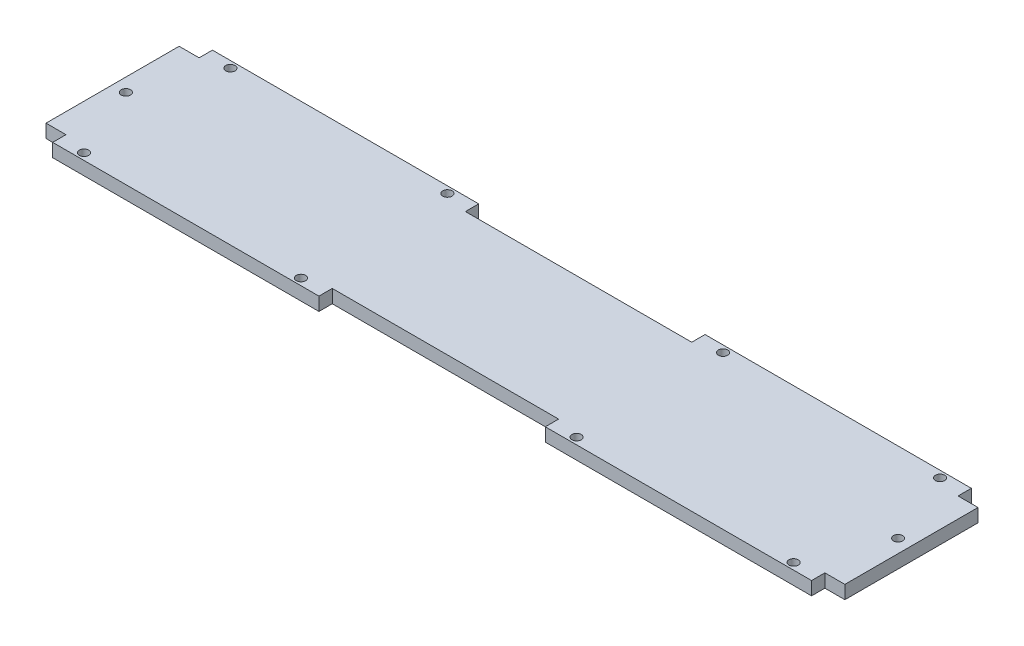
ISO-10303-21;
HEADER;
FILE_DESCRIPTION(('STEP AP214'),'2;1');
FILE_NAME('part.step','',(''),(''),'','','');
FILE_SCHEMA(('AUTOMOTIVE_DESIGN { 1 0 10303 214 1 1 1 1 }'));
ENDSEC;
DATA;
#1=APPLICATION_CONTEXT('core data for automotive mechanical design processes');
#2=APPLICATION_PROTOCOL_DEFINITION('international standard','automotive_design',2000,#1);
#3=PRODUCT_CONTEXT('',#1,'mechanical');
#4=PRODUCT('Part','Part','',(#3));
#5=PRODUCT_RELATED_PRODUCT_CATEGORY('part','',(#4));
#6=PRODUCT_DEFINITION_FORMATION('','',#4);
#7=PRODUCT_DEFINITION_CONTEXT('part definition',#1,'design');
#8=PRODUCT_DEFINITION('design','',#6,#7);
#9=PRODUCT_DEFINITION_SHAPE('','',#8);
#10=(LENGTH_UNIT() NAMED_UNIT(*) SI_UNIT(.MILLI.,.METRE.));
#11=(NAMED_UNIT(*) PLANE_ANGLE_UNIT() SI_UNIT($,.RADIAN.));
#12=(NAMED_UNIT(*) SI_UNIT($,.STERADIAN.) SOLID_ANGLE_UNIT());
#13=UNCERTAINTY_MEASURE_WITH_UNIT(LENGTH_MEASURE(1.E-05),#10,'distance_accuracy_value','');
#14=(GEOMETRIC_REPRESENTATION_CONTEXT(3) GLOBAL_UNCERTAINTY_ASSIGNED_CONTEXT((#13)) GLOBAL_UNIT_ASSIGNED_CONTEXT((#10,
#11,#12)) REPRESENTATION_CONTEXT('',''));
#15=CARTESIAN_POINT('',(0.,0.,0.));
#16=DIRECTION('',(0.,0.,1.));
#17=DIRECTION('',(1.,0.,0.));
#18=AXIS2_PLACEMENT_3D('',#15,#16,#17);
#19=CARTESIAN_POINT('',(-133.25,5.,2.50000000000001));
#20=DIRECTION('',(0.,-1.,0.));
#21=DIRECTION('',(0.,0.,-1.));
#22=AXIS2_PLACEMENT_3D('',#19,#20,#21);
#23=CYLINDRICAL_SURFACE('',#22,1.75000000000001);
#24=CARTESIAN_POINT('',(-133.25,5.,2.50000000000001));
#25=DIRECTION('',(0.,1.,0.));
#26=DIRECTION('',(0.,0.,1.));
#27=AXIS2_PLACEMENT_3D('',#24,#25,#26);
#28=CIRCLE('',#27,1.75000000000001);
#29=CARTESIAN_POINT('',(-133.25,5.,4.25000000000002));
#30=VERTEX_POINT('',#29);
#31=EDGE_CURVE('E449',#30,#30,#28,.F.);
#32=ORIENTED_EDGE('',*,*,#31,.F.);
#33=EDGE_LOOP('',(#32));
#34=FACE_BOUND('',#33,.T.);
#35=CARTESIAN_POINT('',(-133.25,0.,2.50000000000001));
#36=DIRECTION('',(0.,1.,0.));
#37=DIRECTION('',(0.,0.,1.));
#38=AXIS2_PLACEMENT_3D('',#35,#36,#37);
#39=CIRCLE('',#38,1.75000000000001);
#40=CARTESIAN_POINT('',(-133.25,0.,4.25000000000002));
#41=VERTEX_POINT('',#40);
#42=EDGE_CURVE('E391',#41,#41,#39,.F.);
#43=ORIENTED_EDGE('',*,*,#42,.T.);
#44=EDGE_LOOP('',(#43));
#45=FACE_BOUND('',#44,.T.);
#46=ADVANCED_FACE('F197',(#34,#45),#23,.F.);
#47=CARTESIAN_POINT('',(-51.75,5.,2.5));
#48=DIRECTION('',(0.,-1.,0.));
#49=DIRECTION('',(0.,0.,-1.));
#50=AXIS2_PLACEMENT_3D('',#47,#48,#49);
#51=CYLINDRICAL_SURFACE('',#50,1.75);
#52=CARTESIAN_POINT('',(-51.75,5.,2.5));
#53=DIRECTION('',(0.,1.,0.));
#54=DIRECTION('',(0.,0.,1.));
#55=AXIS2_PLACEMENT_3D('',#52,#53,#54);
#56=CIRCLE('',#55,1.75);
#57=CARTESIAN_POINT('',(-51.75,5.,4.25));
#58=VERTEX_POINT('',#57);
#59=EDGE_CURVE('E445',#58,#58,#56,.T.);
#60=ORIENTED_EDGE('',*,*,#59,.T.);
#61=EDGE_LOOP('',(#60));
#62=FACE_BOUND('',#61,.T.);
#63=CARTESIAN_POINT('',(-51.75,0.,2.5));
#64=DIRECTION('',(0.,1.,0.));
#65=DIRECTION('',(0.,0.,1.));
#66=AXIS2_PLACEMENT_3D('',#63,#64,#65);
#67=CIRCLE('',#66,1.75);
#68=CARTESIAN_POINT('',(-51.75,0.,4.25));
#69=VERTEX_POINT('',#68);
#70=EDGE_CURVE('E504',#69,#69,#67,.T.);
#71=ORIENTED_EDGE('',*,*,#70,.F.);
#72=EDGE_LOOP('',(#71));
#73=FACE_BOUND('',#72,.T.);
#74=ADVANCED_FACE('F620',(#62,#73),#51,.F.);
#75=CARTESIAN_POINT('',(51.75,5.,2.49999999999955));
#76=DIRECTION('',(0.,-1.,0.));
#77=DIRECTION('',(0.,0.,-1.));
#78=AXIS2_PLACEMENT_3D('',#75,#76,#77);
#79=CYLINDRICAL_SURFACE('',#78,1.75);
#80=CARTESIAN_POINT('',(51.75,5.,2.49999999999955));
#81=DIRECTION('',(0.,1.,0.));
#82=DIRECTION('',(0.,0.,1.));
#83=AXIS2_PLACEMENT_3D('',#80,#81,#82);
#84=CIRCLE('',#83,1.75);
#85=CARTESIAN_POINT('',(51.75,5.,4.24999999999956));
#86=VERTEX_POINT('',#85);
#87=EDGE_CURVE('E441',#86,#86,#84,.F.);
#88=ORIENTED_EDGE('',*,*,#87,.F.);
#89=EDGE_LOOP('',(#88));
#90=FACE_BOUND('',#89,.T.);
#91=CARTESIAN_POINT('',(51.75,0.,2.49999999999955));
#92=DIRECTION('',(0.,1.,0.));
#93=DIRECTION('',(0.,0.,1.));
#94=AXIS2_PLACEMENT_3D('',#91,#92,#93);
#95=CIRCLE('',#94,1.75);
#96=CARTESIAN_POINT('',(51.75,0.,4.24999999999956));
#97=VERTEX_POINT('',#96);
#98=EDGE_CURVE('E500',#97,#97,#95,.F.);
#99=ORIENTED_EDGE('',*,*,#98,.T.);
#100=EDGE_LOOP('',(#99));
#101=FACE_BOUND('',#100,.T.);
#102=ADVANCED_FACE('F626',(#90,#101),#79,.F.);
#103=CARTESIAN_POINT('',(133.25,5.,2.50000000000001));
#104=DIRECTION('',(0.,-1.,0.));
#105=DIRECTION('',(0.,0.,-1.));
#106=AXIS2_PLACEMENT_3D('',#103,#104,#105);
#107=CYLINDRICAL_SURFACE('',#106,1.75000000000001);
#108=CARTESIAN_POINT('',(133.25,5.,2.50000000000001));
#109=DIRECTION('',(0.,1.,0.));
#110=DIRECTION('',(0.,0.,1.));
#111=AXIS2_PLACEMENT_3D('',#108,#109,#110);
#112=CIRCLE('',#111,1.75000000000001);
#113=CARTESIAN_POINT('',(133.25,5.,4.25000000000002));
#114=VERTEX_POINT('',#113);
#115=EDGE_CURVE('E437',#114,#114,#112,.T.);
#116=ORIENTED_EDGE('',*,*,#115,.T.);
#117=EDGE_LOOP('',(#116));
#118=FACE_BOUND('',#117,.T.);
#119=CARTESIAN_POINT('',(133.25,0.,2.50000000000001));
#120=DIRECTION('',(0.,1.,0.));
#121=DIRECTION('',(0.,0.,1.));
#122=AXIS2_PLACEMENT_3D('',#119,#120,#121);
#123=CIRCLE('',#122,1.75000000000001);
#124=CARTESIAN_POINT('',(133.25,0.,4.25000000000002));
#125=VERTEX_POINT('',#124);
#126=EDGE_CURVE('E496',#125,#125,#123,.T.);
#127=ORIENTED_EDGE('',*,*,#126,.F.);
#128=EDGE_LOOP('',(#127));
#129=FACE_BOUND('',#128,.T.);
#130=ADVANCED_FACE('F636',(#118,#129),#107,.F.);
#131=CARTESIAN_POINT('',(0.,5.,0.));
#132=DIRECTION('',(0.,0.,-1.));
#133=DIRECTION('',(-1.,0.,0.));
#134=AXIS2_PLACEMENT_3D('',#131,#132,#133);
#135=PLANE('',#134);
#136=DIRECTION('',(1.,0.,0.));
#137=VECTOR('',#136,1.);
#138=CARTESIAN_POINT('',(0.,0.,0.));
#139=LINE('',#138,#137);
#140=CARTESIAN_POINT('',(142.5,0.,0.));
#141=VERTEX_POINT('',#140);
#142=CARTESIAN_POINT('',(150.,0.,0.));
#143=VERTEX_POINT('',#142);
#144=EDGE_CURVE('E471',#141,#143,#139,.T.);
#145=ORIENTED_EDGE('',*,*,#144,.T.);
#146=DIRECTION('',(0.,-1.,0.));
#147=VECTOR('',#146,1.);
#148=CARTESIAN_POINT('',(150.,5.,0.));
#149=LINE('',#148,#147);
#150=CARTESIAN_POINT('',(150.,5.,0.));
#151=VERTEX_POINT('',#150);
#152=EDGE_CURVE('E453',#151,#143,#149,.T.);
#153=ORIENTED_EDGE('',*,*,#152,.F.);
#154=DIRECTION('',(1.,0.,0.));
#155=VECTOR('',#154,1.);
#156=CARTESIAN_POINT('',(0.,5.,0.));
#157=LINE('',#156,#155);
#158=CARTESIAN_POINT('',(142.5,5.,0.));
#159=VERTEX_POINT('',#158);
#160=EDGE_CURVE('E411',#159,#151,#157,.T.);
#161=ORIENTED_EDGE('',*,*,#160,.F.);
#162=DIRECTION('',(0.,-1.,0.));
#163=VECTOR('',#162,1.);
#164=CARTESIAN_POINT('',(142.5,5.,0.));
#165=LINE('',#164,#163);
#166=EDGE_CURVE('E514',#159,#141,#165,.T.);
#167=ORIENTED_EDGE('',*,*,#166,.T.);
#168=EDGE_LOOP('',(#145,#153,#161,#167));
#169=FACE_BOUND('',#168,.T.);
#170=ADVANCED_FACE('F640',(#169),#135,.F.);
#171=CARTESIAN_POINT('',(142.5,5.,0.));
#172=DIRECTION('',(-1.,0.,0.));
#173=DIRECTION('',(0.,0.,1.));
#174=AXIS2_PLACEMENT_3D('',#171,#172,#173);
#175=PLANE('',#174);
#176=DIRECTION('',(0.,0.,-1.));
#177=VECTOR('',#176,1.);
#178=CARTESIAN_POINT('',(142.5,0.,0.));
#179=LINE('',#178,#177);
#180=CARTESIAN_POINT('',(142.5,0.,5.));
#181=VERTEX_POINT('',#180);
#182=EDGE_CURVE('E492',#181,#141,#179,.T.);
#183=ORIENTED_EDGE('',*,*,#182,.T.);
#184=ORIENTED_EDGE('',*,*,#166,.F.);
#185=DIRECTION('',(0.,0.,-1.));
#186=VECTOR('',#185,1.);
#187=CARTESIAN_POINT('',(142.5,5.,0.));
#188=LINE('',#187,#186);
#189=CARTESIAN_POINT('',(142.5,5.,5.));
#190=VERTEX_POINT('',#189);
#191=EDGE_CURVE('E433',#190,#159,#188,.T.);
#192=ORIENTED_EDGE('',*,*,#191,.F.);
#193=DIRECTION('',(0.,-1.,0.));
#194=VECTOR('',#193,1.);
#195=CARTESIAN_POINT('',(142.5,5.,5.));
#196=LINE('',#195,#194);
#197=EDGE_CURVE('E518',#190,#181,#196,.T.);
#198=ORIENTED_EDGE('',*,*,#197,.T.);
#199=EDGE_LOOP('',(#183,#184,#192,#198));
#200=FACE_BOUND('',#199,.T.);
#201=ADVANCED_FACE('F644',(#200),#175,.F.);
#202=CARTESIAN_POINT('',(0.,5.,5.00000000000001));
#203=DIRECTION('',(0.,0.,1.));
#204=DIRECTION('',(1.,0.,0.));
#205=AXIS2_PLACEMENT_3D('',#202,#203,#204);
#206=PLANE('',#205);
#207=DIRECTION('',(-1.,0.,0.));
#208=VECTOR('',#207,1.);
#209=CARTESIAN_POINT('',(0.,0.,5.00000000000001));
#210=LINE('',#209,#208);
#211=CARTESIAN_POINT('',(42.5,0.,5.00000000000001));
#212=VERTEX_POINT('',#211);
#213=EDGE_CURVE('E488',#181,#212,#210,.T.);
#214=ORIENTED_EDGE('',*,*,#213,.F.);
#215=ORIENTED_EDGE('',*,*,#197,.F.);
#216=DIRECTION('',(-1.,0.,0.));
#217=VECTOR('',#216,1.);
#218=CARTESIAN_POINT('',(0.,5.,5.00000000000001));
#219=LINE('',#218,#217);
#220=CARTESIAN_POINT('',(42.5,5.,5.00000000000001));
#221=VERTEX_POINT('',#220);
#222=EDGE_CURVE('E429',#190,#221,#219,.T.);
#223=ORIENTED_EDGE('',*,*,#222,.T.);
#224=DIRECTION('',(0.,-1.,0.));
#225=VECTOR('',#224,1.);
#226=CARTESIAN_POINT('',(42.5,5.,5.00000000000001));
#227=LINE('',#226,#225);
#228=EDGE_CURVE('E522',#221,#212,#227,.T.);
#229=ORIENTED_EDGE('',*,*,#228,.T.);
#230=EDGE_LOOP('',(#214,#215,#223,#229));
#231=FACE_BOUND('',#230,.T.);
#232=ADVANCED_FACE('F649',(#231),#206,.T.);
#233=CARTESIAN_POINT('',(42.5,5.,0.));
#234=DIRECTION('',(-1.,0.,0.));
#235=DIRECTION('',(0.,0.,1.));
#236=AXIS2_PLACEMENT_3D('',#233,#234,#235);
#237=PLANE('',#236);
#238=DIRECTION('',(0.,0.,-1.));
#239=VECTOR('',#238,1.);
#240=CARTESIAN_POINT('',(42.5,0.,0.));
#241=LINE('',#240,#239);
#242=CARTESIAN_POINT('',(42.5,0.,0.));
#243=VERTEX_POINT('',#242);
#244=EDGE_CURVE('E484',#212,#243,#241,.T.);
#245=ORIENTED_EDGE('',*,*,#244,.F.);
#246=ORIENTED_EDGE('',*,*,#228,.F.);
#247=DIRECTION('',(0.,0.,-1.));
#248=VECTOR('',#247,1.);
#249=CARTESIAN_POINT('',(42.5,5.,0.));
#250=LINE('',#249,#248);
#251=CARTESIAN_POINT('',(42.5,5.,0.));
#252=VERTEX_POINT('',#251);
#253=EDGE_CURVE('E425',#221,#252,#250,.T.);
#254=ORIENTED_EDGE('',*,*,#253,.T.);
#255=DIRECTION('',(0.,-1.,0.));
#256=VECTOR('',#255,1.);
#257=CARTESIAN_POINT('',(42.5,5.,0.));
#258=LINE('',#257,#256);
#259=EDGE_CURVE('E526',#252,#243,#258,.T.);
#260=ORIENTED_EDGE('',*,*,#259,.T.);
#261=EDGE_LOOP('',(#245,#246,#254,#260));
#262=FACE_BOUND('',#261,.T.);
#263=ADVANCED_FACE('F653',(#262),#237,.T.);
#264=CARTESIAN_POINT('',(-42.5,0.,0.));
#265=VERTEX_POINT('',#264);
#266=EDGE_CURVE('E472',#265,#243,#139,.T.);
#267=ORIENTED_EDGE('',*,*,#266,.T.);
#268=ORIENTED_EDGE('',*,*,#259,.F.);
#269=CARTESIAN_POINT('',(-42.5,5.,0.));
#270=VERTEX_POINT('',#269);
#271=EDGE_CURVE('E412',#270,#252,#157,.T.);
#272=ORIENTED_EDGE('',*,*,#271,.F.);
#273=DIRECTION('',(0.,-1.,0.));
#274=VECTOR('',#273,1.);
#275=CARTESIAN_POINT('',(-42.5,5.,0.));
#276=LINE('',#275,#274);
#277=EDGE_CURVE('E530',#270,#265,#276,.T.);
#278=ORIENTED_EDGE('',*,*,#277,.T.);
#279=EDGE_LOOP('',(#267,#268,#272,#278));
#280=FACE_BOUND('',#279,.T.);
#281=ADVANCED_FACE('F646',(#280),#135,.F.);
#282=CARTESIAN_POINT('',(-42.5,5.,0.));
#283=DIRECTION('',(-1.,0.,0.));
#284=DIRECTION('',(0.,0.,1.));
#285=AXIS2_PLACEMENT_3D('',#282,#283,#284);
#286=PLANE('',#285);
#287=DIRECTION('',(0.,0.,-1.));
#288=VECTOR('',#287,1.);
#289=CARTESIAN_POINT('',(-42.5,0.,0.));
#290=LINE('',#289,#288);
#291=CARTESIAN_POINT('',(-42.5,0.,5.00000000000001));
#292=VERTEX_POINT('',#291);
#293=EDGE_CURVE('E480',#292,#265,#290,.T.);
#294=ORIENTED_EDGE('',*,*,#293,.T.);
#295=ORIENTED_EDGE('',*,*,#277,.F.);
#296=DIRECTION('',(0.,0.,-1.));
#297=VECTOR('',#296,1.);
#298=CARTESIAN_POINT('',(-42.5,5.,0.));
#299=LINE('',#298,#297);
#300=CARTESIAN_POINT('',(-42.5,5.,5.00000000000001));
#301=VERTEX_POINT('',#300);
#302=EDGE_CURVE('E421',#301,#270,#299,.T.);
#303=ORIENTED_EDGE('',*,*,#302,.F.);
#304=DIRECTION('',(0.,-1.,0.));
#305=VECTOR('',#304,1.);
#306=CARTESIAN_POINT('',(-42.5,5.,5.00000000000001));
#307=LINE('',#306,#305);
#308=EDGE_CURVE('E534',#301,#292,#307,.T.);
#309=ORIENTED_EDGE('',*,*,#308,.T.);
#310=EDGE_LOOP('',(#294,#295,#303,#309));
#311=FACE_BOUND('',#310,.T.);
#312=ADVANCED_FACE('F658',(#311),#286,.F.);
#313=CARTESIAN_POINT('',(0.,5.,5.00000000000001));
#314=DIRECTION('',(0.,0.,-1.));
#315=DIRECTION('',(-1.,0.,0.));
#316=AXIS2_PLACEMENT_3D('',#313,#314,#315);
#317=PLANE('',#316);
#318=DIRECTION('',(1.,0.,0.));
#319=VECTOR('',#318,1.);
#320=CARTESIAN_POINT('',(0.,0.,5.00000000000001));
#321=LINE('',#320,#319);
#322=CARTESIAN_POINT('',(-142.5,0.,5.00000000000002));
#323=VERTEX_POINT('',#322);
#324=EDGE_CURVE('E476',#323,#292,#321,.T.);
#325=ORIENTED_EDGE('',*,*,#324,.T.);
#326=ORIENTED_EDGE('',*,*,#308,.F.);
#327=DIRECTION('',(1.,0.,0.));
#328=VECTOR('',#327,1.);
#329=CARTESIAN_POINT('',(0.,5.,5.00000000000001));
#330=LINE('',#329,#328);
#331=CARTESIAN_POINT('',(-142.5,5.,5.00000000000002));
#332=VERTEX_POINT('',#331);
#333=EDGE_CURVE('E417',#332,#301,#330,.T.);
#334=ORIENTED_EDGE('',*,*,#333,.F.);
#335=DIRECTION('',(0.,-1.,0.));
#336=VECTOR('',#335,1.);
#337=CARTESIAN_POINT('',(-142.5,5.,5.00000000000002));
#338=LINE('',#337,#336);
#339=EDGE_CURVE('E538',#332,#323,#338,.T.);
#340=ORIENTED_EDGE('',*,*,#339,.T.);
#341=EDGE_LOOP('',(#325,#326,#334,#340));
#342=FACE_BOUND('',#341,.T.);
#343=ADVANCED_FACE('F661',(#342),#317,.F.);
#344=CARTESIAN_POINT('',(-142.5,5.,0.));
#345=DIRECTION('',(-1.,0.,0.));
#346=DIRECTION('',(0.,0.,1.));
#347=AXIS2_PLACEMENT_3D('',#344,#345,#346);
#348=PLANE('',#347);
#349=DIRECTION('',(0.,0.,-1.));
#350=VECTOR('',#349,1.);
#351=CARTESIAN_POINT('',(-142.5,0.,0.));
#352=LINE('',#351,#350);
#353=CARTESIAN_POINT('',(-142.5,0.,0.));
#354=VERTEX_POINT('',#353);
#355=EDGE_CURVE('E470',#323,#354,#352,.T.);
#356=ORIENTED_EDGE('',*,*,#355,.F.);
#357=ORIENTED_EDGE('',*,*,#339,.F.);
#358=DIRECTION('',(0.,0.,-1.));
#359=VECTOR('',#358,1.);
#360=CARTESIAN_POINT('',(-142.5,5.,0.));
#361=LINE('',#360,#359);
#362=CARTESIAN_POINT('',(-142.5,5.,0.));
#363=VERTEX_POINT('',#362);
#364=EDGE_CURVE('E409',#332,#363,#361,.T.);
#365=ORIENTED_EDGE('',*,*,#364,.T.);
#366=DIRECTION('',(0.,-1.,0.));
#367=VECTOR('',#366,1.);
#368=CARTESIAN_POINT('',(-142.5,5.,0.));
#369=LINE('',#368,#367);
#370=EDGE_CURVE('E542',#363,#354,#369,.T.);
#371=ORIENTED_EDGE('',*,*,#370,.T.);
#372=EDGE_LOOP('',(#356,#357,#365,#371));
#373=FACE_BOUND('',#372,.T.);
#374=ADVANCED_FACE('F566',(#373),#348,.T.);
#375=CARTESIAN_POINT('',(-150.,0.,0.));
#376=VERTEX_POINT('',#375);
#377=EDGE_CURVE('E466',#376,#354,#139,.T.);
#378=ORIENTED_EDGE('',*,*,#377,.T.);
#379=ORIENTED_EDGE('',*,*,#370,.F.);
#380=CARTESIAN_POINT('',(-150.,5.,0.));
#381=VERTEX_POINT('',#380);
#382=EDGE_CURVE('E403',#381,#363,#157,.T.);
#383=ORIENTED_EDGE('',*,*,#382,.F.);
#384=DIRECTION('',(0.,-1.,0.));
#385=VECTOR('',#384,1.);
#386=CARTESIAN_POINT('',(-150.,5.,0.));
#387=LINE('',#386,#385);
#388=EDGE_CURVE('E301',#381,#376,#387,.T.);
#389=ORIENTED_EDGE('',*,*,#388,.T.);
#390=EDGE_LOOP('',(#378,#379,#383,#389));
#391=FACE_BOUND('',#390,.T.);
#392=ADVANCED_FACE('F551',(#391),#135,.F.);
#393=CARTESIAN_POINT('',(-150.,5.,0.));
#394=DIRECTION('',(1.,0.,0.));
#395=DIRECTION('',(0.,0.,-1.));
#396=AXIS2_PLACEMENT_3D('',#393,#394,#395);
#397=PLANE('',#396);
#398=DIRECTION('',(0.,0.,1.));
#399=VECTOR('',#398,1.);
#400=CARTESIAN_POINT('',(-150.,0.,0.));
#401=LINE('',#400,#399);
#402=CARTESIAN_POINT('',(-150.,0.,-50.));
#403=VERTEX_POINT('',#402);
#404=EDGE_CURVE('E461',#403,#376,#401,.T.);
#405=ORIENTED_EDGE('',*,*,#404,.T.);
#406=ORIENTED_EDGE('',*,*,#388,.F.);
#407=DIRECTION('',(0.,0.,1.));
#408=VECTOR('',#407,1.);
#409=CARTESIAN_POINT('',(-150.,5.,0.));
#410=LINE('',#409,#408);
#411=CARTESIAN_POINT('',(-150.,5.,-50.));
#412=VERTEX_POINT('',#411);
#413=EDGE_CURVE('E396',#412,#381,#410,.T.);
#414=ORIENTED_EDGE('',*,*,#413,.F.);
#415=DIRECTION('',(0.,-1.,0.));
#416=VECTOR('',#415,1.);
#417=CARTESIAN_POINT('',(-150.,5.,-50.));
#418=LINE('',#417,#416);
#419=EDGE_CURVE('E295',#412,#403,#418,.T.);
#420=ORIENTED_EDGE('',*,*,#419,.T.);
#421=EDGE_LOOP('',(#405,#406,#414,#420));
#422=FACE_BOUND('',#421,.T.);
#423=ADVANCED_FACE('F666',(#422),#397,.F.);
#424=CARTESIAN_POINT('',(150.,5.,0.));
#425=DIRECTION('',(1.,0.,0.));
#426=DIRECTION('',(0.,0.,-1.));
#427=AXIS2_PLACEMENT_3D('',#424,#425,#426);
#428=PLANE('',#427);
#429=DIRECTION('',(0.,0.,1.));
#430=VECTOR('',#429,1.);
#431=CARTESIAN_POINT('',(150.,0.,0.));
#432=LINE('',#431,#430);
#433=CARTESIAN_POINT('',(150.,0.,-50.0000000000001));
#434=VERTEX_POINT('',#433);
#435=EDGE_CURVE('E350',#434,#143,#432,.T.);
#436=ORIENTED_EDGE('',*,*,#435,.F.);
#437=DIRECTION('',(0.,-1.,0.));
#438=VECTOR('',#437,1.);
#439=CARTESIAN_POINT('',(150.,5.,-50.0000000000001));
#440=LINE('',#439,#438);
#441=CARTESIAN_POINT('',(150.,5.,-50.0000000000001));
#442=VERTEX_POINT('',#441);
#443=EDGE_CURVE('E288',#442,#434,#440,.T.);
#444=ORIENTED_EDGE('',*,*,#443,.F.);
#445=DIRECTION('',(0.,0.,1.));
#446=VECTOR('',#445,1.);
#447=CARTESIAN_POINT('',(150.,5.,0.));
#448=LINE('',#447,#446);
#449=EDGE_CURVE('E384',#442,#151,#448,.T.);
#450=ORIENTED_EDGE('',*,*,#449,.T.);
#451=ORIENTED_EDGE('',*,*,#152,.T.);
#452=EDGE_LOOP('',(#436,#444,#450,#451));
#453=FACE_BOUND('',#452,.T.);
#454=ADVANCED_FACE('F668',(#453),#428,.T.);
#455=CARTESIAN_POINT('',(0.,0.,0.));
#456=DIRECTION('',(0.,1.,0.));
#457=DIRECTION('',(0.,0.,1.));
#458=AXIS2_PLACEMENT_3D('',#455,#456,#457);
#459=PLANE('',#458);
#460=CARTESIAN_POINT('',(-145.,0.,-25.));
#461=DIRECTION('',(0.,1.,0.));
#462=DIRECTION('',(0.,0.,1.));
#463=AXIS2_PLACEMENT_3D('',#460,#461,#462);
#464=CIRCLE('',#463,1.75000000000001);
#465=CARTESIAN_POINT('',(-145.,0.,-23.25));
#466=VERTEX_POINT('',#465);
#467=EDGE_CURVE('E364',#466,#466,#464,.T.);
#468=ORIENTED_EDGE('',*,*,#467,.T.);
#469=EDGE_LOOP('',(#468));
#470=FACE_BOUND('',#469,.T.);
#471=CARTESIAN_POINT('',(145.,0.,-25.0000000000009));
#472=DIRECTION('',(0.,1.,0.));
#473=DIRECTION('',(0.,0.,1.));
#474=AXIS2_PLACEMENT_3D('',#471,#472,#473);
#475=CIRCLE('',#474,1.75000000000001);
#476=CARTESIAN_POINT('',(145.,0.,-23.2500000000009));
#477=VERTEX_POINT('',#476);
#478=EDGE_CURVE('E915',#477,#477,#475,.T.);
#479=ORIENTED_EDGE('',*,*,#478,.T.);
#480=EDGE_LOOP('',(#479));
#481=FACE_BOUND('',#480,.T.);
#482=ORIENTED_EDGE('',*,*,#435,.T.);
#483=ORIENTED_EDGE('',*,*,#144,.F.);
#484=ORIENTED_EDGE('',*,*,#182,.F.);
#485=ORIENTED_EDGE('',*,*,#213,.T.);
#486=ORIENTED_EDGE('',*,*,#244,.T.);
#487=ORIENTED_EDGE('',*,*,#266,.F.);
#488=ORIENTED_EDGE('',*,*,#293,.F.);
#489=ORIENTED_EDGE('',*,*,#324,.F.);
#490=ORIENTED_EDGE('',*,*,#355,.T.);
#491=ORIENTED_EDGE('',*,*,#377,.F.);
#492=ORIENTED_EDGE('',*,*,#404,.F.);
#493=DIRECTION('',(1.,0.,0.));
#494=VECTOR('',#493,1.);
#495=CARTESIAN_POINT('',(0.,0.,-50.));
#496=LINE('',#495,#494);
#497=CARTESIAN_POINT('',(-142.5,0.,-50.));
#498=VERTEX_POINT('',#497);
#499=EDGE_CURVE('E457',#403,#498,#496,.T.);
#500=ORIENTED_EDGE('',*,*,#499,.T.);
#501=DIRECTION('',(0.,0.,1.));
#502=VECTOR('',#501,1.);
#503=CARTESIAN_POINT('',(-142.5,0.,-55.));
#504=LINE('',#503,#502);
#505=CARTESIAN_POINT('',(-142.5,0.,-55.));
#506=VERTEX_POINT('',#505);
#507=EDGE_CURVE('E318',#506,#498,#504,.T.);
#508=ORIENTED_EDGE('',*,*,#507,.F.);
#509=DIRECTION('',(1.,0.,0.));
#510=VECTOR('',#509,1.);
#511=CARTESIAN_POINT('',(-142.5,0.,-55.));
#512=LINE('',#511,#510);
#513=CARTESIAN_POINT('',(-42.5,0.,-55.));
#514=VERTEX_POINT('',#513);
#515=EDGE_CURVE('E327',#506,#514,#512,.T.);
#516=ORIENTED_EDGE('',*,*,#515,.T.);
#517=DIRECTION('',(0.,0.,1.));
#518=VECTOR('',#517,1.);
#519=CARTESIAN_POINT('',(-42.5,0.,-55.));
#520=LINE('',#519,#518);
#521=CARTESIAN_POINT('',(-42.5,0.,-50.));
#522=VERTEX_POINT('',#521);
#523=EDGE_CURVE('E339',#514,#522,#520,.T.);
#524=ORIENTED_EDGE('',*,*,#523,.T.);
#525=CARTESIAN_POINT('',(42.5,0.,-50.));
#526=VERTEX_POINT('',#525);
#527=EDGE_CURVE('E462',#522,#526,#496,.T.);
#528=ORIENTED_EDGE('',*,*,#527,.T.);
#529=DIRECTION('',(0.,0.,1.));
#530=VECTOR('',#529,1.);
#531=CARTESIAN_POINT('',(42.5,0.,-55.));
#532=LINE('',#531,#530);
#533=CARTESIAN_POINT('',(42.5,0.,-55.));
#534=VERTEX_POINT('',#533);
#535=EDGE_CURVE('E248',#534,#526,#532,.T.);
#536=ORIENTED_EDGE('',*,*,#535,.F.);
#537=DIRECTION('',(-1.,0.,0.));
#538=VECTOR('',#537,1.);
#539=CARTESIAN_POINT('',(142.5,0.,-55.));
#540=LINE('',#539,#538);
#541=CARTESIAN_POINT('',(142.5,0.,-55.));
#542=VERTEX_POINT('',#541);
#543=EDGE_CURVE('E256',#542,#534,#540,.T.);
#544=ORIENTED_EDGE('',*,*,#543,.F.);
#545=DIRECTION('',(0.,0.,1.));
#546=VECTOR('',#545,1.);
#547=CARTESIAN_POINT('',(142.5,0.,-55.));
#548=LINE('',#547,#546);
#549=CARTESIAN_POINT('',(142.5,0.,-50.0000000000001));
#550=VERTEX_POINT('',#549);
#551=EDGE_CURVE('E271',#542,#550,#548,.T.);
#552=ORIENTED_EDGE('',*,*,#551,.T.);
#553=EDGE_CURVE('E456',#550,#434,#496,.T.);
#554=ORIENTED_EDGE('',*,*,#553,.T.);
#555=EDGE_LOOP('',(#482,#483,#484,#485,#486,#487,#488,#489,#490,#491,#492,#500,#508,#516,#524,
#528,#536,#544,#552,#554));
#556=FACE_BOUND('',#555,.T.);
#557=ORIENTED_EDGE('',*,*,#126,.T.);
#558=EDGE_LOOP('',(#557));
#559=FACE_BOUND('',#558,.T.);
#560=ORIENTED_EDGE('',*,*,#98,.F.);
#561=EDGE_LOOP('',(#560));
#562=FACE_BOUND('',#561,.T.);
#563=ORIENTED_EDGE('',*,*,#70,.T.);
#564=EDGE_LOOP('',(#563));
#565=FACE_BOUND('',#564,.T.);
#566=ORIENTED_EDGE('',*,*,#42,.F.);
#567=EDGE_LOOP('',(#566));
#568=FACE_BOUND('',#567,.T.);
#569=CARTESIAN_POINT('',(-51.75,0.,-52.5));
#570=DIRECTION('',(0.,-1.,0.));
#571=DIRECTION('',(0.,0.,-1.));
#572=AXIS2_PLACEMENT_3D('',#569,#570,#571);
#573=CIRCLE('',#572,1.75);
#574=CARTESIAN_POINT('',(-51.75,0.,-54.25));
#575=VERTEX_POINT('',#574);
#576=EDGE_CURVE('E310',#575,#575,#573,.T.);
#577=ORIENTED_EDGE('',*,*,#576,.F.);
#578=EDGE_LOOP('',(#577));
#579=FACE_BOUND('',#578,.T.);
#580=CARTESIAN_POINT('',(-133.25,0.,-52.5));
#581=DIRECTION('',(0.,1.,0.));
#582=DIRECTION('',(0.,0.,1.));
#583=AXIS2_PLACEMENT_3D('',#580,#581,#582);
#584=CIRCLE('',#583,1.75000000000001);
#585=CARTESIAN_POINT('',(-133.25,0.,-50.75));
#586=VERTEX_POINT('',#585);
#587=EDGE_CURVE('E309',#586,#586,#584,.T.);
#588=ORIENTED_EDGE('',*,*,#587,.T.);
#589=EDGE_LOOP('',(#588));
#590=FACE_BOUND('',#589,.T.);
#591=CARTESIAN_POINT('',(133.25,0.,-52.5));
#592=DIRECTION('',(0.,-1.,0.));
#593=DIRECTION('',(0.,0.,-1.));
#594=AXIS2_PLACEMENT_3D('',#591,#592,#593);
#595=CIRCLE('',#594,1.75000000000001);
#596=CARTESIAN_POINT('',(133.25,0.,-54.25));
#597=VERTEX_POINT('',#596);
#598=EDGE_CURVE('E360',#597,#597,#595,.T.);
#599=ORIENTED_EDGE('',*,*,#598,.F.);
#600=EDGE_LOOP('',(#599));
#601=FACE_BOUND('',#600,.T.);
#602=CARTESIAN_POINT('',(51.75,0.,-52.4999999999996));
#603=DIRECTION('',(0.,1.,0.));
#604=DIRECTION('',(0.,0.,1.));
#605=AXIS2_PLACEMENT_3D('',#602,#603,#604);
#606=CIRCLE('',#605,1.75);
#607=CARTESIAN_POINT('',(51.75,0.,-50.7499999999996));
#608=VERTEX_POINT('',#607);
#609=EDGE_CURVE('E359',#608,#608,#606,.T.);
#610=ORIENTED_EDGE('',*,*,#609,.T.);
#611=EDGE_LOOP('',(#610));
#612=FACE_BOUND('',#611,.T.);
#613=ADVANCED_FACE('F267',(#470,#481,#556,#559,#562,#565,#568,#579,#590,#601,#612),#459,.F.);
#614=CARTESIAN_POINT('',(0.,5.,0.));
#615=DIRECTION('',(0.,1.,0.));
#616=DIRECTION('',(0.,0.,1.));
#617=AXIS2_PLACEMENT_3D('',#614,#615,#616);
#618=PLANE('',#617);
#619=CARTESIAN_POINT('',(-145.,5.,-25.));
#620=DIRECTION('',(0.,1.,0.));
#621=DIRECTION('',(0.,0.,1.));
#622=AXIS2_PLACEMENT_3D('',#619,#620,#621);
#623=CIRCLE('',#622,1.75000000000001);
#624=CARTESIAN_POINT('',(-145.,5.,-23.25));
#625=VERTEX_POINT('',#624);
#626=EDGE_CURVE('E911',#625,#625,#623,.T.);
#627=ORIENTED_EDGE('',*,*,#626,.F.);
#628=EDGE_LOOP('',(#627));
#629=FACE_BOUND('',#628,.T.);
#630=CARTESIAN_POINT('',(145.,5.,-25.0000000000009));
#631=DIRECTION('',(0.,1.,0.));
#632=DIRECTION('',(0.,0.,-1.));
#633=AXIS2_PLACEMENT_3D('',#630,#631,#632);
#634=CIRCLE('',#633,1.75000000000001);
#635=CARTESIAN_POINT('',(145.,5.,-26.7500000000009));
#636=VERTEX_POINT('',#635);
#637=EDGE_CURVE('E921',#636,#636,#634,.T.);
#638=ORIENTED_EDGE('',*,*,#637,.F.);
#639=EDGE_LOOP('',(#638));
#640=FACE_BOUND('',#639,.T.);
#641=ORIENTED_EDGE('',*,*,#449,.F.);
#642=DIRECTION('',(1.,0.,0.));
#643=VECTOR('',#642,1.);
#644=CARTESIAN_POINT('',(0.,5.,-50.));
#645=LINE('',#644,#643);
#646=CARTESIAN_POINT('',(142.5,5.,-50.0000000000001));
#647=VERTEX_POINT('',#646);
#648=EDGE_CURVE('E378',#647,#442,#645,.T.);
#649=ORIENTED_EDGE('',*,*,#648,.F.);
#650=DIRECTION('',(0.,0.,1.));
#651=VECTOR('',#650,1.);
#652=CARTESIAN_POINT('',(142.5,5.,-55.));
#653=LINE('',#652,#651);
#654=CARTESIAN_POINT('',(142.5,5.,-55.));
#655=VERTEX_POINT('',#654);
#656=EDGE_CURVE('E263',#655,#647,#653,.T.);
#657=ORIENTED_EDGE('',*,*,#656,.F.);
#658=DIRECTION('',(-1.,0.,0.));
#659=VECTOR('',#658,1.);
#660=CARTESIAN_POINT('',(142.5,5.,-55.));
#661=LINE('',#660,#659);
#662=CARTESIAN_POINT('',(42.5,5.,-55.));
#663=VERTEX_POINT('',#662);
#664=EDGE_CURVE('E258',#655,#663,#661,.T.);
#665=ORIENTED_EDGE('',*,*,#664,.T.);
#666=DIRECTION('',(0.,0.,1.));
#667=VECTOR('',#666,1.);
#668=CARTESIAN_POINT('',(42.5,5.,-55.));
#669=LINE('',#668,#667);
#670=CARTESIAN_POINT('',(42.5,5.,-50.));
#671=VERTEX_POINT('',#670);
#672=EDGE_CURVE('E280',#663,#671,#669,.T.);
#673=ORIENTED_EDGE('',*,*,#672,.T.);
#674=CARTESIAN_POINT('',(-42.5,5.,-50.));
#675=VERTEX_POINT('',#674);
#676=EDGE_CURVE('E386',#675,#671,#645,.T.);
#677=ORIENTED_EDGE('',*,*,#676,.F.);
#678=DIRECTION('',(0.,0.,1.));
#679=VECTOR('',#678,1.);
#680=CARTESIAN_POINT('',(-42.5,5.,-55.));
#681=LINE('',#680,#679);
#682=CARTESIAN_POINT('',(-42.5,5.,-55.));
#683=VERTEX_POINT('',#682);
#684=EDGE_CURVE('E326',#683,#675,#681,.T.);
#685=ORIENTED_EDGE('',*,*,#684,.F.);
#686=DIRECTION('',(1.,0.,0.));
#687=VECTOR('',#686,1.);
#688=CARTESIAN_POINT('',(-142.5,5.,-55.));
#689=LINE('',#688,#687);
#690=CARTESIAN_POINT('',(-142.5,5.,-55.));
#691=VERTEX_POINT('',#690);
#692=EDGE_CURVE('E331',#691,#683,#689,.T.);
#693=ORIENTED_EDGE('',*,*,#692,.F.);
#694=DIRECTION('',(0.,0.,1.));
#695=VECTOR('',#694,1.);
#696=CARTESIAN_POINT('',(-142.5,5.,-55.));
#697=LINE('',#696,#695);
#698=CARTESIAN_POINT('',(-142.5,5.,-50.));
#699=VERTEX_POINT('',#698);
#700=EDGE_CURVE('E322',#691,#699,#697,.T.);
#701=ORIENTED_EDGE('',*,*,#700,.T.);
#702=EDGE_CURVE('E388',#412,#699,#645,.T.);
#703=ORIENTED_EDGE('',*,*,#702,.F.);
#704=ORIENTED_EDGE('',*,*,#413,.T.);
#705=ORIENTED_EDGE('',*,*,#382,.T.);
#706=ORIENTED_EDGE('',*,*,#364,.F.);
#707=ORIENTED_EDGE('',*,*,#333,.T.);
#708=ORIENTED_EDGE('',*,*,#302,.T.);
#709=ORIENTED_EDGE('',*,*,#271,.T.);
#710=ORIENTED_EDGE('',*,*,#253,.F.);
#711=ORIENTED_EDGE('',*,*,#222,.F.);
#712=ORIENTED_EDGE('',*,*,#191,.T.);
#713=ORIENTED_EDGE('',*,*,#160,.T.);
#714=EDGE_LOOP('',(#641,#649,#657,#665,#673,#677,#685,#693,#701,#703,#704,#705,#706,#707,#708,
#709,#710,#711,#712,#713));
#715=FACE_BOUND('',#714,.T.);
#716=ORIENTED_EDGE('',*,*,#115,.F.);
#717=EDGE_LOOP('',(#716));
#718=FACE_BOUND('',#717,.T.);
#719=ORIENTED_EDGE('',*,*,#87,.T.);
#720=EDGE_LOOP('',(#719));
#721=FACE_BOUND('',#720,.T.);
#722=ORIENTED_EDGE('',*,*,#59,.F.);
#723=EDGE_LOOP('',(#722));
#724=FACE_BOUND('',#723,.T.);
#725=ORIENTED_EDGE('',*,*,#31,.T.);
#726=EDGE_LOOP('',(#725));
#727=FACE_BOUND('',#726,.T.);
#728=CARTESIAN_POINT('',(-51.75,5.,-52.5));
#729=DIRECTION('',(0.,-1.,0.));
#730=DIRECTION('',(0.,0.,-1.));
#731=AXIS2_PLACEMENT_3D('',#728,#729,#730);
#732=CIRCLE('',#731,1.75);
#733=CARTESIAN_POINT('',(-51.75,5.,-54.25));
#734=VERTEX_POINT('',#733);
#735=EDGE_CURVE('E305',#734,#734,#732,.T.);
#736=ORIENTED_EDGE('',*,*,#735,.T.);
#737=EDGE_LOOP('',(#736));
#738=FACE_BOUND('',#737,.T.);
#739=CARTESIAN_POINT('',(-133.25,5.,-52.5));
#740=DIRECTION('',(0.,1.,0.));
#741=DIRECTION('',(0.,0.,1.));
#742=AXIS2_PLACEMENT_3D('',#739,#740,#741);
#743=CIRCLE('',#742,1.75000000000001);
#744=CARTESIAN_POINT('',(-133.25,5.,-50.75));
#745=VERTEX_POINT('',#744);
#746=EDGE_CURVE('E314',#745,#745,#743,.T.);
#747=ORIENTED_EDGE('',*,*,#746,.F.);
#748=EDGE_LOOP('',(#747));
#749=FACE_BOUND('',#748,.T.);
#750=CARTESIAN_POINT('',(133.25,5.,-52.5));
#751=DIRECTION('',(0.,-1.,0.));
#752=DIRECTION('',(0.,0.,-1.));
#753=AXIS2_PLACEMENT_3D('',#750,#751,#752);
#754=CIRCLE('',#753,1.75000000000001);
#755=CARTESIAN_POINT('',(133.25,5.,-54.25));
#756=VERTEX_POINT('',#755);
#757=EDGE_CURVE('E355',#756,#756,#754,.T.);
#758=ORIENTED_EDGE('',*,*,#757,.T.);
#759=EDGE_LOOP('',(#758));
#760=FACE_BOUND('',#759,.T.);
#761=CARTESIAN_POINT('',(51.75,5.,-52.4999999999996));
#762=DIRECTION('',(0.,1.,0.));
#763=DIRECTION('',(0.,0.,1.));
#764=AXIS2_PLACEMENT_3D('',#761,#762,#763);
#765=CIRCLE('',#764,1.75);
#766=CARTESIAN_POINT('',(51.75,5.,-50.7499999999996));
#767=VERTEX_POINT('',#766);
#768=EDGE_CURVE('E273',#767,#767,#765,.T.);
#769=ORIENTED_EDGE('',*,*,#768,.F.);
#770=EDGE_LOOP('',(#769));
#771=FACE_BOUND('',#770,.T.);
#772=ADVANCED_FACE('F379',(#629,#640,#715,#718,#721,#724,#727,#738,#749,#760,#771),#618,.T.);
#773=CARTESIAN_POINT('',(0.,5.,-50.));
#774=DIRECTION('',(0.,0.,-1.));
#775=DIRECTION('',(-1.,0.,0.));
#776=AXIS2_PLACEMENT_3D('',#773,#774,#775);
#777=PLANE('',#776);
#778=DIRECTION('',(0.,-1.,0.));
#779=VECTOR('',#778,1.);
#780=CARTESIAN_POINT('',(-42.5,5.,-50.));
#781=LINE('',#780,#779);
#782=EDGE_CURVE('E12',#675,#522,#781,.T.);
#783=ORIENTED_EDGE('',*,*,#782,.F.);
#784=ORIENTED_EDGE('',*,*,#676,.T.);
#785=DIRECTION('',(0.,-1.,0.));
#786=VECTOR('',#785,1.);
#787=CARTESIAN_POINT('',(42.5,5.,-50.));
#788=LINE('',#787,#786);
#789=EDGE_CURVE('E285',#671,#526,#788,.T.);
#790=ORIENTED_EDGE('',*,*,#789,.T.);
#791=ORIENTED_EDGE('',*,*,#527,.F.);
#792=EDGE_LOOP('',(#783,#784,#790,#791));
#793=FACE_BOUND('',#792,.T.);
#794=ADVANCED_FACE('F595',(#793),#777,.T.);
#795=DIRECTION('',(0.,-1.,0.));
#796=VECTOR('',#795,1.);
#797=CARTESIAN_POINT('',(142.5,5.,-50.));
#798=LINE('',#797,#796);
#799=EDGE_CURVE('E217',#647,#550,#798,.T.);
#800=ORIENTED_EDGE('',*,*,#799,.F.);
#801=ORIENTED_EDGE('',*,*,#648,.T.);
#802=ORIENTED_EDGE('',*,*,#443,.T.);
#803=ORIENTED_EDGE('',*,*,#553,.F.);
#804=EDGE_LOOP('',(#800,#801,#802,#803));
#805=FACE_BOUND('',#804,.T.);
#806=ADVANCED_FACE('F608',(#805),#777,.T.);
#807=ORIENTED_EDGE('',*,*,#702,.T.);
#808=DIRECTION('',(0.,-1.,0.));
#809=VECTOR('',#808,1.);
#810=CARTESIAN_POINT('',(-142.5,5.,-50.));
#811=LINE('',#810,#809);
#812=EDGE_CURVE('E208',#699,#498,#811,.T.);
#813=ORIENTED_EDGE('',*,*,#812,.T.);
#814=ORIENTED_EDGE('',*,*,#499,.F.);
#815=ORIENTED_EDGE('',*,*,#419,.F.);
#816=EDGE_LOOP('',(#807,#813,#814,#815));
#817=FACE_BOUND('',#816,.T.);
#818=ADVANCED_FACE('F610',(#817),#777,.T.);
#819=CARTESIAN_POINT('',(51.75,5.,-52.4999999999996));
#820=DIRECTION('',(0.,-1.,0.));
#821=DIRECTION('',(0.,0.,-1.));
#822=AXIS2_PLACEMENT_3D('',#819,#820,#821);
#823=CYLINDRICAL_SURFACE('',#822,1.75);
#824=ORIENTED_EDGE('',*,*,#768,.T.);
#825=EDGE_LOOP('',(#824));
#826=FACE_BOUND('',#825,.T.);
#827=ORIENTED_EDGE('',*,*,#609,.F.);
#828=EDGE_LOOP('',(#827));
#829=FACE_BOUND('',#828,.T.);
#830=ADVANCED_FACE('F616',(#826,#829),#823,.F.);
#831=CARTESIAN_POINT('',(133.25,5.,-52.5));
#832=DIRECTION('',(0.,-1.,0.));
#833=DIRECTION('',(0.,0.,-1.));
#834=AXIS2_PLACEMENT_3D('',#831,#832,#833);
#835=CYLINDRICAL_SURFACE('',#834,1.75000000000001);
#836=ORIENTED_EDGE('',*,*,#757,.F.);
#837=EDGE_LOOP('',(#836));
#838=FACE_BOUND('',#837,.T.);
#839=ORIENTED_EDGE('',*,*,#598,.T.);
#840=EDGE_LOOP('',(#839));
#841=FACE_BOUND('',#840,.T.);
#842=ADVANCED_FACE('F786',(#838,#841),#835,.F.);
#843=CARTESIAN_POINT('',(142.5,5.,-55.));
#844=DIRECTION('',(0.,0.,1.));
#845=DIRECTION('',(1.,0.,0.));
#846=AXIS2_PLACEMENT_3D('',#843,#844,#845);
#847=PLANE('',#846);
#848=ORIENTED_EDGE('',*,*,#543,.T.);
#849=DIRECTION('',(0.,-1.,0.));
#850=VECTOR('',#849,1.);
#851=CARTESIAN_POINT('',(42.5,5.,-55.));
#852=LINE('',#851,#850);
#853=EDGE_CURVE('E201',#663,#534,#852,.T.);
#854=ORIENTED_EDGE('',*,*,#853,.F.);
#855=ORIENTED_EDGE('',*,*,#664,.F.);
#856=DIRECTION('',(0.,-1.,0.));
#857=VECTOR('',#856,1.);
#858=CARTESIAN_POINT('',(142.5,5.,-55.));
#859=LINE('',#858,#857);
#860=EDGE_CURVE('E254',#655,#542,#859,.T.);
#861=ORIENTED_EDGE('',*,*,#860,.T.);
#862=EDGE_LOOP('',(#848,#854,#855,#861));
#863=FACE_BOUND('',#862,.T.);
#864=ADVANCED_FACE('F199',(#863),#847,.F.);
#865=CARTESIAN_POINT('',(42.5,5.,-55.));
#866=DIRECTION('',(1.,0.,0.));
#867=DIRECTION('',(0.,0.,-1.));
#868=AXIS2_PLACEMENT_3D('',#865,#866,#867);
#869=PLANE('',#868);
#870=ORIENTED_EDGE('',*,*,#535,.T.);
#871=ORIENTED_EDGE('',*,*,#789,.F.);
#872=ORIENTED_EDGE('',*,*,#672,.F.);
#873=ORIENTED_EDGE('',*,*,#853,.T.);
#874=EDGE_LOOP('',(#870,#871,#872,#873));
#875=FACE_BOUND('',#874,.T.);
#876=ADVANCED_FACE('F603',(#875),#869,.F.);
#877=CARTESIAN_POINT('',(142.5,5.,-55.));
#878=DIRECTION('',(1.,0.,0.));
#879=DIRECTION('',(0.,0.,-1.));
#880=AXIS2_PLACEMENT_3D('',#877,#878,#879);
#881=PLANE('',#880);
#882=ORIENTED_EDGE('',*,*,#551,.F.);
#883=ORIENTED_EDGE('',*,*,#860,.F.);
#884=ORIENTED_EDGE('',*,*,#656,.T.);
#885=ORIENTED_EDGE('',*,*,#799,.T.);
#886=EDGE_LOOP('',(#882,#883,#884,#885));
#887=FACE_BOUND('',#886,.T.);
#888=ADVANCED_FACE('F275',(#887),#881,.T.);
#889=CARTESIAN_POINT('',(-133.25,5.,-52.5));
#890=DIRECTION('',(0.,-1.,0.));
#891=DIRECTION('',(0.,0.,-1.));
#892=AXIS2_PLACEMENT_3D('',#889,#890,#891);
#893=CYLINDRICAL_SURFACE('',#892,1.75000000000001);
#894=ORIENTED_EDGE('',*,*,#746,.T.);
#895=EDGE_LOOP('',(#894));
#896=FACE_BOUND('',#895,.T.);
#897=ORIENTED_EDGE('',*,*,#587,.F.);
#898=EDGE_LOOP('',(#897));
#899=FACE_BOUND('',#898,.T.);
#900=ADVANCED_FACE('F820',(#896,#899),#893,.F.);
#901=CARTESIAN_POINT('',(-51.75,5.,-52.5));
#902=DIRECTION('',(0.,-1.,0.));
#903=DIRECTION('',(0.,0.,-1.));
#904=AXIS2_PLACEMENT_3D('',#901,#902,#903);
#905=CYLINDRICAL_SURFACE('',#904,1.75);
#906=ORIENTED_EDGE('',*,*,#735,.F.);
#907=EDGE_LOOP('',(#906));
#908=FACE_BOUND('',#907,.T.);
#909=ORIENTED_EDGE('',*,*,#576,.T.);
#910=EDGE_LOOP('',(#909));
#911=FACE_BOUND('',#910,.T.);
#912=ADVANCED_FACE('F829',(#908,#911),#905,.F.);
#913=CARTESIAN_POINT('',(-142.5,5.,-55.));
#914=DIRECTION('',(0.,0.,-1.));
#915=DIRECTION('',(-1.,0.,0.));
#916=AXIS2_PLACEMENT_3D('',#913,#914,#915);
#917=PLANE('',#916);
#918=ORIENTED_EDGE('',*,*,#515,.F.);
#919=DIRECTION('',(0.,-1.,0.));
#920=VECTOR('',#919,1.);
#921=CARTESIAN_POINT('',(-142.5,5.,-55.));
#922=LINE('',#921,#920);
#923=EDGE_CURVE('E335',#691,#506,#922,.T.);
#924=ORIENTED_EDGE('',*,*,#923,.F.);
#925=ORIENTED_EDGE('',*,*,#692,.T.);
#926=DIRECTION('',(0.,-1.,0.));
#927=VECTOR('',#926,1.);
#928=CARTESIAN_POINT('',(-42.5,5.,-55.));
#929=LINE('',#928,#927);
#930=EDGE_CURVE('E348',#683,#514,#929,.T.);
#931=ORIENTED_EDGE('',*,*,#930,.T.);
#932=EDGE_LOOP('',(#918,#924,#925,#931));
#933=FACE_BOUND('',#932,.T.);
#934=ADVANCED_FACE('F832',(#933),#917,.T.);
#935=CARTESIAN_POINT('',(-142.5,5.,-55.));
#936=DIRECTION('',(1.,0.,0.));
#937=DIRECTION('',(0.,0.,-1.));
#938=AXIS2_PLACEMENT_3D('',#935,#936,#937);
#939=PLANE('',#938);
#940=ORIENTED_EDGE('',*,*,#507,.T.);
#941=ORIENTED_EDGE('',*,*,#812,.F.);
#942=ORIENTED_EDGE('',*,*,#700,.F.);
#943=ORIENTED_EDGE('',*,*,#923,.T.);
#944=EDGE_LOOP('',(#940,#941,#942,#943));
#945=FACE_BOUND('',#944,.T.);
#946=ADVANCED_FACE('F798',(#945),#939,.F.);
#947=CARTESIAN_POINT('',(-42.5,5.,-55.));
#948=DIRECTION('',(1.,0.,0.));
#949=DIRECTION('',(0.,0.,-1.));
#950=AXIS2_PLACEMENT_3D('',#947,#948,#949);
#951=PLANE('',#950);
#952=ORIENTED_EDGE('',*,*,#523,.F.);
#953=ORIENTED_EDGE('',*,*,#930,.F.);
#954=ORIENTED_EDGE('',*,*,#684,.T.);
#955=ORIENTED_EDGE('',*,*,#782,.T.);
#956=EDGE_LOOP('',(#952,#953,#954,#955));
#957=FACE_BOUND('',#956,.T.);
#958=ADVANCED_FACE('F600',(#957),#951,.T.);
#959=CARTESIAN_POINT('',(145.,-5.,-25.0000000000009));
#960=DIRECTION('',(0.,1.,0.));
#961=DIRECTION('',(0.,0.,1.));
#962=AXIS2_PLACEMENT_3D('',#959,#960,#961);
#963=CYLINDRICAL_SURFACE('',#962,1.75000000000001);
#964=ORIENTED_EDGE('',*,*,#637,.T.);
#965=EDGE_LOOP('',(#964));
#966=FACE_BOUND('',#965,.T.);
#967=ORIENTED_EDGE('',*,*,#478,.F.);
#968=EDGE_LOOP('',(#967));
#969=FACE_BOUND('',#968,.T.);
#970=ADVANCED_FACE('F842',(#966,#969),#963,.F.);
#971=CARTESIAN_POINT('',(-145.,-5.,-25.));
#972=DIRECTION('',(0.,1.,0.));
#973=DIRECTION('',(0.,0.,1.));
#974=AXIS2_PLACEMENT_3D('',#971,#972,#973);
#975=CYLINDRICAL_SURFACE('',#974,1.75000000000001);
#976=ORIENTED_EDGE('',*,*,#626,.T.);
#977=EDGE_LOOP('',(#976));
#978=FACE_BOUND('',#977,.T.);
#979=ORIENTED_EDGE('',*,*,#467,.F.);
#980=EDGE_LOOP('',(#979));
#981=FACE_BOUND('',#980,.T.);
#982=ADVANCED_FACE('F894',(#978,#981),#975,.F.);
#983=CLOSED_SHELL('',(#46,#74,#102,#130,#170,#201,#232,#263,#281,#312,#343,#374,#392,#423,#454,
#613,#772,#794,#806,#818,#830,#842,#864,#876,#888,#900,#912,#934,#946,#958,#970,#982));
#984=MANIFOLD_SOLID_BREP('B2',#983);
#985=ADVANCED_BREP_SHAPE_REPRESENTATION('',(#18,#984),#14);
#986=SHAPE_DEFINITION_REPRESENTATION(#9,#985);
ENDSEC;
END-ISO-10303-21;
